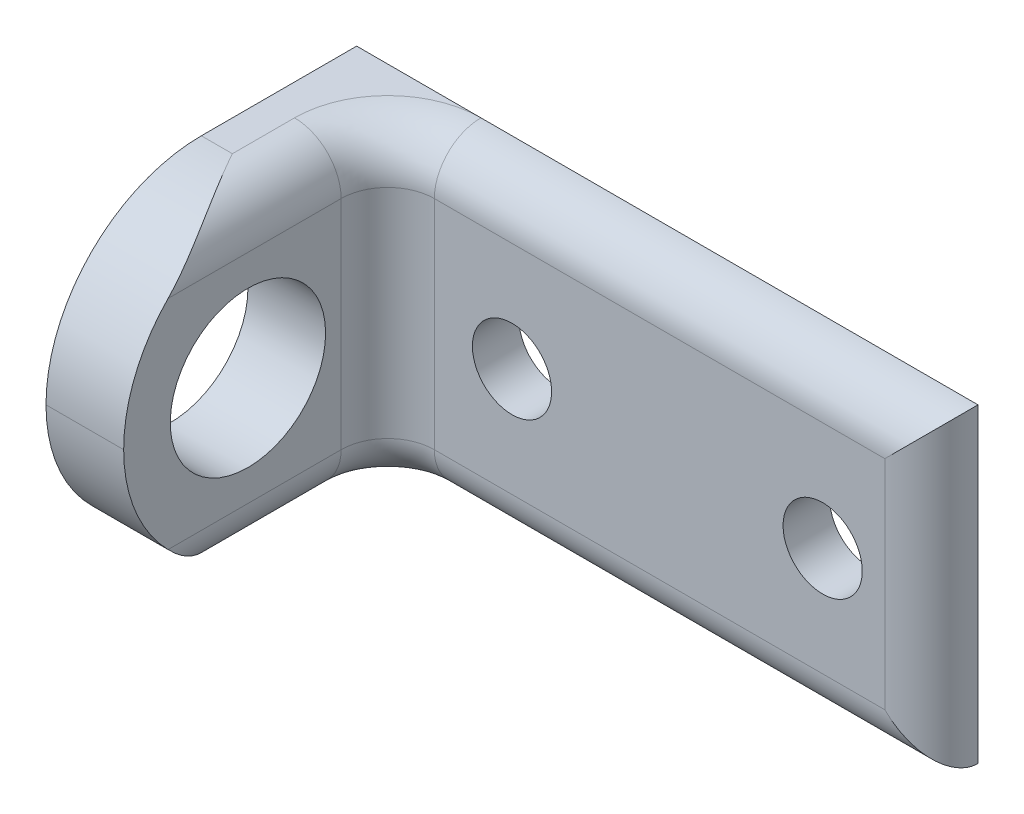
ISO-10303-21;
HEADER;
FILE_DESCRIPTION(('STEP AP214'),'2;1');
FILE_NAME('part.step','',(''),(''),'','','');
FILE_SCHEMA(('AUTOMOTIVE_DESIGN { 1 0 10303 214 1 1 1 1 }'));
ENDSEC;
DATA;
#1=APPLICATION_CONTEXT('core data for automotive mechanical design processes');
#2=APPLICATION_PROTOCOL_DEFINITION('international standard','automotive_design',2000,#1);
#3=PRODUCT_CONTEXT('',#1,'mechanical');
#4=PRODUCT('Part','Part','',(#3));
#5=PRODUCT_RELATED_PRODUCT_CATEGORY('part','',(#4));
#6=PRODUCT_DEFINITION_FORMATION('','',#4);
#7=PRODUCT_DEFINITION_CONTEXT('part definition',#1,'design');
#8=PRODUCT_DEFINITION('design','',#6,#7);
#9=PRODUCT_DEFINITION_SHAPE('','',#8);
#10=(LENGTH_UNIT() NAMED_UNIT(*) SI_UNIT(.MILLI.,.METRE.));
#11=(NAMED_UNIT(*) PLANE_ANGLE_UNIT() SI_UNIT($,.RADIAN.));
#12=(NAMED_UNIT(*) SI_UNIT($,.STERADIAN.) SOLID_ANGLE_UNIT());
#13=UNCERTAINTY_MEASURE_WITH_UNIT(LENGTH_MEASURE(1.E-05),#10,'distance_accuracy_value','');
#14=(GEOMETRIC_REPRESENTATION_CONTEXT(3) GLOBAL_UNCERTAINTY_ASSIGNED_CONTEXT((#13)) GLOBAL_UNIT_ASSIGNED_CONTEXT((#10,
#11,#12)) REPRESENTATION_CONTEXT('',''));
#15=CARTESIAN_POINT('',(0.,0.,0.));
#16=DIRECTION('',(0.,0.,1.));
#17=DIRECTION('',(1.,0.,0.));
#18=AXIS2_PLACEMENT_3D('',#15,#16,#17);
#19=CARTESIAN_POINT('',(-20.,-10.,3.));
#20=DIRECTION('',(0.,1.,0.));
#21=DIRECTION('',(0.,0.,1.));
#22=AXIS2_PLACEMENT_3D('',#19,#20,#21);
#23=PLANE('',#22);
#24=CARTESIAN_POINT('',(-12.,-10.,6.));
#25=DIRECTION('',(0.,1.,0.));
#26=DIRECTION('',(0.,0.,1.));
#27=AXIS2_PLACEMENT_3D('',#24,#25,#26);
#28=CIRCLE('',#27,6.);
#29=CARTESIAN_POINT('',(-18.,-10.,6.));
#30=VERTEX_POINT('',#29);
#31=CARTESIAN_POINT('',(-12.,-10.,0.));
#32=VERTEX_POINT('',#31);
#33=EDGE_CURVE('E242',#30,#32,#28,.F.);
#34=ORIENTED_EDGE('',*,*,#33,.F.);
#35=DIRECTION('',(0.,0.,-1.));
#36=VECTOR('',#35,1.);
#37=CARTESIAN_POINT('',(-18.,-10.,3.));
#38=LINE('',#37,#36);
#39=CARTESIAN_POINT('',(-18.,-10.,10.));
#40=VERTEX_POINT('',#39);
#41=EDGE_CURVE('E240',#30,#40,#38,.F.);
#42=ORIENTED_EDGE('',*,*,#41,.T.);
#43=DIRECTION('',(1.,0.,0.));
#44=VECTOR('',#43,1.);
#45=CARTESIAN_POINT('',(-20.,-10.,10.));
#46=LINE('',#45,#44);
#47=CARTESIAN_POINT('',(-20.,-10.,10.));
#48=VERTEX_POINT('',#47);
#49=EDGE_CURVE('E238',#40,#48,#46,.F.);
#50=ORIENTED_EDGE('',*,*,#49,.T.);
#51=DIRECTION('',(0.,0.,-1.));
#52=VECTOR('',#51,1.);
#53=CARTESIAN_POINT('',(-20.,-10.,3.));
#54=LINE('',#53,#52);
#55=CARTESIAN_POINT('',(-20.,-10.,0.));
#56=VERTEX_POINT('',#55);
#57=EDGE_CURVE('E257',#48,#56,#54,.T.);
#58=ORIENTED_EDGE('',*,*,#57,.T.);
#59=DIRECTION('',(1.,0.,0.));
#60=VECTOR('',#59,1.);
#61=CARTESIAN_POINT('',(-20.,-10.,0.));
#62=LINE('',#61,#60);
#63=EDGE_CURVE('E285',#56,#32,#62,.T.);
#64=ORIENTED_EDGE('',*,*,#63,.T.);
#65=EDGE_LOOP('',(#34,#42,#50,#58,#64));
#66=FACE_BOUND('',#65,.T.);
#67=ADVANCED_FACE('F34',(#66),#23,.F.);
#68=CARTESIAN_POINT('',(-20.,10.,3.));
#69=DIRECTION('',(0.,-1.,0.));
#70=DIRECTION('',(0.,0.,-1.));
#71=AXIS2_PLACEMENT_3D('',#68,#69,#70);
#72=PLANE('',#71);
#73=CARTESIAN_POINT('',(-12.,10.,6.));
#74=DIRECTION('',(0.,-1.,0.));
#75=DIRECTION('',(0.,0.,-1.));
#76=AXIS2_PLACEMENT_3D('',#73,#74,#75);
#77=CIRCLE('',#76,6.);
#78=CARTESIAN_POINT('',(-12.,10.,0.));
#79=VERTEX_POINT('',#78);
#80=CARTESIAN_POINT('',(-18.,10.,6.));
#81=VERTEX_POINT('',#80);
#82=EDGE_CURVE('E231',#79,#81,#77,.F.);
#83=ORIENTED_EDGE('',*,*,#82,.F.);
#84=DIRECTION('',(-1.,0.,0.));
#85=VECTOR('',#84,1.);
#86=CARTESIAN_POINT('',(-20.,10.,0.));
#87=LINE('',#86,#85);
#88=CARTESIAN_POINT('',(-20.,10.,0.));
#89=VERTEX_POINT('',#88);
#90=EDGE_CURVE('E125',#79,#89,#87,.T.);
#91=ORIENTED_EDGE('',*,*,#90,.T.);
#92=DIRECTION('',(0.,0.,-1.));
#93=VECTOR('',#92,1.);
#94=CARTESIAN_POINT('',(-20.,10.,3.));
#95=LINE('',#94,#93);
#96=CARTESIAN_POINT('',(-20.,10.,10.));
#97=VERTEX_POINT('',#96);
#98=EDGE_CURVE('E254',#97,#89,#95,.T.);
#99=ORIENTED_EDGE('',*,*,#98,.F.);
#100=DIRECTION('',(-1.,0.,0.));
#101=VECTOR('',#100,1.);
#102=CARTESIAN_POINT('',(-15.,10.,10.));
#103=LINE('',#102,#101);
#104=CARTESIAN_POINT('',(-18.,10.,10.));
#105=VERTEX_POINT('',#104);
#106=EDGE_CURVE('E256',#97,#105,#103,.F.);
#107=ORIENTED_EDGE('',*,*,#106,.T.);
#108=DIRECTION('',(0.,0.,-1.));
#109=VECTOR('',#108,1.);
#110=CARTESIAN_POINT('',(-18.,10.,3.));
#111=LINE('',#110,#109);
#112=EDGE_CURVE('E260',#105,#81,#111,.T.);
#113=ORIENTED_EDGE('',*,*,#112,.T.);
#114=EDGE_LOOP('',(#83,#91,#99,#107,#113));
#115=FACE_BOUND('',#114,.T.);
#116=ADVANCED_FACE('F176',(#115),#72,.F.);
#117=CARTESIAN_POINT('',(0.,0.,3.));
#118=DIRECTION('',(0.,0.,-1.));
#119=DIRECTION('',(-1.,0.,0.));
#120=AXIS2_PLACEMENT_3D('',#117,#118,#119);
#121=PLANE('',#120);
#122=CARTESIAN_POINT('',(13.,0.,3.));
#123=DIRECTION('',(0.,0.,-1.));
#124=DIRECTION('',(-1.,0.,0.));
#125=AXIS2_PLACEMENT_3D('',#122,#123,#124);
#126=CIRCLE('',#125,2.55);
#127=CARTESIAN_POINT('',(10.45,0.,3.));
#128=VERTEX_POINT('',#127);
#129=EDGE_CURVE('E269',#128,#128,#126,.F.);
#130=ORIENTED_EDGE('',*,*,#129,.F.);
#131=EDGE_LOOP('',(#130));
#132=FACE_BOUND('',#131,.T.);
#133=CARTESIAN_POINT('',(-6.99999999999999,0.,3.));
#134=DIRECTION('',(0.,0.,-1.));
#135=DIRECTION('',(-1.,0.,0.));
#136=AXIS2_PLACEMENT_3D('',#133,#134,#135);
#137=CIRCLE('',#136,2.55);
#138=CARTESIAN_POINT('',(-9.54999999999999,0.,3.));
#139=VERTEX_POINT('',#138);
#140=EDGE_CURVE('E271',#139,#139,#137,.F.);
#141=ORIENTED_EDGE('',*,*,#140,.F.);
#142=EDGE_LOOP('',(#141));
#143=FACE_BOUND('',#142,.T.);
#144=DIRECTION('',(0.,1.,0.));
#145=VECTOR('',#144,1.);
#146=CARTESIAN_POINT('',(17.,0.,3.));
#147=LINE('',#146,#145);
#148=CARTESIAN_POINT('',(17.,-7.,3.));
#149=VERTEX_POINT('',#148);
#150=CARTESIAN_POINT('',(17.,7.,3.));
#151=VERTEX_POINT('',#150);
#152=EDGE_CURVE('E57',#149,#151,#147,.T.);
#153=ORIENTED_EDGE('',*,*,#152,.T.);
#154=DIRECTION('',(-1.,0.,0.));
#155=VECTOR('',#154,1.);
#156=CARTESIAN_POINT('',(0.,7.,3.));
#157=LINE('',#156,#155);
#158=CARTESIAN_POINT('',(-12.,7.,3.));
#159=VERTEX_POINT('',#158);
#160=EDGE_CURVE('E141',#151,#159,#157,.T.);
#161=ORIENTED_EDGE('',*,*,#160,.T.);
#162=DIRECTION('',(0.,1.,0.));
#163=VECTOR('',#162,1.);
#164=CARTESIAN_POINT('',(-12.,-10.,3.));
#165=LINE('',#164,#163);
#166=CARTESIAN_POINT('',(-12.,-7.,3.));
#167=VERTEX_POINT('',#166);
#168=EDGE_CURVE('E245',#159,#167,#165,.F.);
#169=ORIENTED_EDGE('',*,*,#168,.T.);
#170=DIRECTION('',(1.,0.,0.));
#171=VECTOR('',#170,1.);
#172=CARTESIAN_POINT('',(0.,-7.,3.));
#173=LINE('',#172,#171);
#174=EDGE_CURVE('E247',#167,#149,#173,.T.);
#175=ORIENTED_EDGE('',*,*,#174,.T.);
#176=EDGE_LOOP('',(#153,#161,#169,#175));
#177=FACE_BOUND('',#176,.T.);
#178=ADVANCED_FACE('F182',(#132,#143,#177),#121,.F.);
#179=CARTESIAN_POINT('',(-20.,-10.,3.));
#180=DIRECTION('',(1.,0.,0.));
#181=DIRECTION('',(0.,0.,-1.));
#182=AXIS2_PLACEMENT_3D('',#179,#180,#181);
#183=PLANE('',#182);
#184=CARTESIAN_POINT('',(-20.,0.,12.));
#185=DIRECTION('',(1.,0.,0.));
#186=DIRECTION('',(0.,0.,-1.));
#187=AXIS2_PLACEMENT_3D('',#184,#185,#186);
#188=CIRCLE('',#187,5.);
#189=CARTESIAN_POINT('',(-20.,0.,7.));
#190=VERTEX_POINT('',#189);
#191=EDGE_CURVE('E280',#190,#190,#188,.T.);
#192=ORIENTED_EDGE('',*,*,#191,.T.);
#193=EDGE_LOOP('',(#192));
#194=FACE_BOUND('',#193,.T.);
#195=ORIENTED_EDGE('',*,*,#57,.F.);
#196=CARTESIAN_POINT('',(-20.,0.,10.));
#197=DIRECTION('',(1.,0.,0.));
#198=DIRECTION('',(0.,0.,-1.));
#199=AXIS2_PLACEMENT_3D('',#196,#197,#198);
#200=CIRCLE('',#199,10.);
#201=CARTESIAN_POINT('',(-20.,0.,20.));
#202=VERTEX_POINT('',#201);
#203=EDGE_CURVE('E12',#48,#202,#200,.F.);
#204=ORIENTED_EDGE('',*,*,#203,.T.);
#205=CARTESIAN_POINT('',(-20.,0.,10.));
#206=DIRECTION('',(1.,0.,0.));
#207=DIRECTION('',(0.,0.,-1.));
#208=AXIS2_PLACEMENT_3D('',#205,#206,#207);
#209=CIRCLE('',#208,10.);
#210=EDGE_CURVE('E43',#202,#97,#209,.F.);
#211=ORIENTED_EDGE('',*,*,#210,.T.);
#212=ORIENTED_EDGE('',*,*,#98,.T.);
#213=DIRECTION('',(0.,-1.,0.));
#214=VECTOR('',#213,1.);
#215=CARTESIAN_POINT('',(-20.,-10.,0.));
#216=LINE('',#215,#214);
#217=EDGE_CURVE('E130',#89,#56,#216,.T.);
#218=ORIENTED_EDGE('',*,*,#217,.T.);
#219=EDGE_LOOP('',(#195,#204,#211,#212,#218));
#220=FACE_BOUND('',#219,.T.);
#221=ADVANCED_FACE('F188',(#194,#220),#183,.F.);
#222=CARTESIAN_POINT('',(0.,0.,0.));
#223=DIRECTION('',(0.,0.,-1.));
#224=DIRECTION('',(-1.,0.,0.));
#225=AXIS2_PLACEMENT_3D('',#222,#223,#224);
#226=PLANE('',#225);
#227=CARTESIAN_POINT('',(13.,0.,0.));
#228=DIRECTION('',(0.,0.,1.));
#229=DIRECTION('',(1.,0.,0.));
#230=AXIS2_PLACEMENT_3D('',#227,#228,#229);
#231=CIRCLE('',#230,2.55);
#232=CARTESIAN_POINT('',(15.55,0.,0.));
#233=VERTEX_POINT('',#232);
#234=EDGE_CURVE('E276',#233,#233,#231,.T.);
#235=ORIENTED_EDGE('',*,*,#234,.T.);
#236=EDGE_LOOP('',(#235));
#237=FACE_BOUND('',#236,.T.);
#238=CARTESIAN_POINT('',(-6.99999999999999,0.,0.));
#239=DIRECTION('',(0.,0.,1.));
#240=DIRECTION('',(1.,0.,0.));
#241=AXIS2_PLACEMENT_3D('',#238,#239,#240);
#242=CIRCLE('',#241,2.55);
#243=CARTESIAN_POINT('',(-4.44999999999999,0.,0.));
#244=VERTEX_POINT('',#243);
#245=EDGE_CURVE('E328',#244,#244,#242,.T.);
#246=ORIENTED_EDGE('',*,*,#245,.T.);
#247=EDGE_LOOP('',(#246));
#248=FACE_BOUND('',#247,.T.);
#249=ORIENTED_EDGE('',*,*,#217,.F.);
#250=ORIENTED_EDGE('',*,*,#90,.F.);
#251=CARTESIAN_POINT('',(20.,10.,0.));
#252=VERTEX_POINT('',#251);
#253=EDGE_CURVE('E119',#252,#79,#87,.T.);
#254=ORIENTED_EDGE('',*,*,#253,.F.);
#255=DIRECTION('',(0.,1.,0.));
#256=VECTOR('',#255,1.);
#257=CARTESIAN_POINT('',(20.,-10.,0.));
#258=LINE('',#257,#256);
#259=CARTESIAN_POINT('',(20.,-10.,0.));
#260=VERTEX_POINT('',#259);
#261=EDGE_CURVE('E123',#260,#252,#258,.T.);
#262=ORIENTED_EDGE('',*,*,#261,.F.);
#263=EDGE_CURVE('E284',#32,#260,#62,.T.);
#264=ORIENTED_EDGE('',*,*,#263,.F.);
#265=ORIENTED_EDGE('',*,*,#63,.F.);
#266=EDGE_LOOP('',(#249,#250,#254,#262,#264,#265));
#267=FACE_BOUND('',#266,.T.);
#268=ADVANCED_FACE('F122',(#237,#248,#267),#226,.T.);
#269=CARTESIAN_POINT('',(-15.,10.,20.));
#270=DIRECTION('',(-1.,0.,0.));
#271=DIRECTION('',(0.,-1.,0.));
#272=AXIS2_PLACEMENT_3D('',#269,#270,#271);
#273=PLANE('',#272);
#274=CARTESIAN_POINT('',(-15.,0.,12.));
#275=DIRECTION('',(-1.,0.,0.));
#276=DIRECTION('',(0.,-1.,0.));
#277=AXIS2_PLACEMENT_3D('',#274,#275,#276);
#278=CIRCLE('',#277,5.);
#279=CARTESIAN_POINT('',(-15.,-5.,12.));
#280=VERTEX_POINT('',#279);
#281=EDGE_CURVE('E138',#280,#280,#278,.T.);
#282=ORIENTED_EDGE('',*,*,#281,.T.);
#283=EDGE_LOOP('',(#282));
#284=FACE_BOUND('',#283,.T.);
#285=DIRECTION('',(0.,0.,-1.));
#286=VECTOR('',#285,1.);
#287=CARTESIAN_POINT('',(-15.,-7.,20.));
#288=LINE('',#287,#286);
#289=CARTESIAN_POINT('',(-15.,-7.,17.1414284285429));
#290=VERTEX_POINT('',#289);
#291=CARTESIAN_POINT('',(-15.,-7.,6.));
#292=VERTEX_POINT('',#291);
#293=EDGE_CURVE('E227',#290,#292,#288,.T.);
#294=ORIENTED_EDGE('',*,*,#293,.T.);
#295=DIRECTION('',(0.,1.,0.));
#296=VECTOR('',#295,1.);
#297=CARTESIAN_POINT('',(-15.,10.,6.));
#298=LINE('',#297,#296);
#299=CARTESIAN_POINT('',(-15.,7.,6.));
#300=VERTEX_POINT('',#299);
#301=EDGE_CURVE('E236',#292,#300,#298,.T.);
#302=ORIENTED_EDGE('',*,*,#301,.T.);
#303=DIRECTION('',(0.,0.,-1.));
#304=VECTOR('',#303,1.);
#305=CARTESIAN_POINT('',(-15.,7.,20.));
#306=LINE('',#305,#304);
#307=CARTESIAN_POINT('',(-15.,7.,17.1414284285428));
#308=VERTEX_POINT('',#307);
#309=EDGE_CURVE('E229',#300,#308,#306,.F.);
#310=ORIENTED_EDGE('',*,*,#309,.T.);
#311=CARTESIAN_POINT('',(-15.,0.,10.));
#312=DIRECTION('',(-1.,0.,0.));
#313=DIRECTION('',(0.,-1.,0.));
#314=AXIS2_PLACEMENT_3D('',#311,#312,#313);
#315=CIRCLE('',#314,10.);
#316=CARTESIAN_POINT('',(-15.,0.,20.));
#317=VERTEX_POINT('',#316);
#318=EDGE_CURVE('E218',#308,#317,#315,.F.);
#319=ORIENTED_EDGE('',*,*,#318,.T.);
#320=CARTESIAN_POINT('',(-15.,0.,10.));
#321=DIRECTION('',(-1.,0.,0.));
#322=DIRECTION('',(0.,-1.,0.));
#323=AXIS2_PLACEMENT_3D('',#320,#321,#322);
#324=CIRCLE('',#323,10.);
#325=EDGE_CURVE('E223',#317,#290,#324,.F.);
#326=ORIENTED_EDGE('',*,*,#325,.T.);
#327=EDGE_LOOP('',(#294,#302,#310,#319,#326));
#328=FACE_BOUND('',#327,.T.);
#329=ADVANCED_FACE('F298',(#284,#328),#273,.F.);
#330=CARTESIAN_POINT('',(-20.,0.,12.));
#331=DIRECTION('',(1.,0.,0.));
#332=DIRECTION('',(0.,0.,-1.));
#333=AXIS2_PLACEMENT_3D('',#330,#331,#332);
#334=CYLINDRICAL_SURFACE('',#333,5.);
#335=ORIENTED_EDGE('',*,*,#191,.F.);
#336=EDGE_LOOP('',(#335));
#337=FACE_BOUND('',#336,.T.);
#338=ORIENTED_EDGE('',*,*,#281,.F.);
#339=EDGE_LOOP('',(#338));
#340=FACE_BOUND('',#339,.T.);
#341=ADVANCED_FACE('F311',(#337,#340),#334,.F.);
#342=CARTESIAN_POINT('',(0.,-7.,0.));
#343=DIRECTION('',(1.,0.,0.));
#344=DIRECTION('',(0.,0.,-1.));
#345=AXIS2_PLACEMENT_3D('',#342,#343,#344);
#346=CYLINDRICAL_SURFACE('',#345,3.);
#347=CARTESIAN_POINT('',(-12.,-7.,0.));
#348=DIRECTION('',(-1.,0.,0.));
#349=DIRECTION('',(0.,0.,1.));
#350=AXIS2_PLACEMENT_3D('',#347,#348,#349);
#351=CIRCLE('',#350,3.);
#352=EDGE_CURVE('E293',#32,#167,#351,.T.);
#353=ORIENTED_EDGE('',*,*,#352,.F.);
#354=ORIENTED_EDGE('',*,*,#263,.T.);
#355=CARTESIAN_POINT('',(17.,-7.,0.));
#356=DIRECTION('',(0.707106781186547,0.707106781186547,0.));
#357=DIRECTION('',(0.707106781186547,-0.707106781186547,0.));
#358=AXIS2_PLACEMENT_3D('',#355,#356,#357);
#359=ELLIPSE('',#358,4.24264068711928,3.);
#360=EDGE_CURVE('E38',#149,#260,#359,.T.);
#361=ORIENTED_EDGE('',*,*,#360,.F.);
#362=ORIENTED_EDGE('',*,*,#174,.F.);
#363=EDGE_LOOP('',(#353,#354,#361,#362));
#364=FACE_BOUND('',#363,.T.);
#365=ADVANCED_FACE('F36',(#364),#346,.T.);
#366=CARTESIAN_POINT('',(-18.,-7.,20.));
#367=DIRECTION('',(0.,0.,-1.));
#368=DIRECTION('',(-1.,0.,0.));
#369=AXIS2_PLACEMENT_3D('',#366,#367,#368);
#370=CYLINDRICAL_SURFACE('',#369,3.);
#371=CARTESIAN_POINT('',(-15.,-7.,17.1414284285429));
#372=CARTESIAN_POINT('',(-15.0000404215242,-7.11978461899118,17.0240547312688));
#373=CARTESIAN_POINT('',(-15.0071684385575,-7.23646398815508,16.9037419237787));
#374=CARTESIAN_POINT('',(-15.0337197390789,-7.46281144496142,16.6583855799033));
#375=CARTESIAN_POINT('',(-15.0531194338389,-7.57249254045578,16.5333515513046));
#376=CARTESIAN_POINT('',(-15.102122663697,-7.78353335626953,16.2804094097201));
#377=CARTESIAN_POINT('',(-15.1316309205253,-7.88496020709181,16.1525382041165));
#378=CARTESIAN_POINT('',(-15.1994060622169,-8.08045535266249,15.8934364767731));
#379=CARTESIAN_POINT('',(-15.2376786484903,-8.17451880365583,15.7622038178991));
#380=CARTESIAN_POINT('',(-15.3423247877262,-8.39959186008119,15.4317711428192));
#381=CARTESIAN_POINT('',(-15.4132616560136,-8.52602155970913,15.2308847345808));
#382=CARTESIAN_POINT('',(-15.5681340696485,-8.76238400243691,14.8245134746684));
#383=CARTESIAN_POINT('',(-15.6520734074084,-8.87231191400441,14.6190272963927));
#384=CARTESIAN_POINT('',(-15.8306687231035,-9.07666034610453,14.2033531381744));
#385=CARTESIAN_POINT('',(-15.9253843465012,-9.17098668694942,13.9931447261343));
#386=CARTESIAN_POINT('',(-16.1228289933826,-9.34380923240271,13.5700776072328));
#387=CARTESIAN_POINT('',(-16.2255575452125,-9.42230636777019,13.3572190569816));
#388=CARTESIAN_POINT('',(-16.4586379441501,-9.57830419020177,12.8860876609365));
#389=CARTESIAN_POINT('',(-16.5903680309685,-9.65237727779146,12.6273555977777));
#390=CARTESIAN_POINT('',(-16.8600243835059,-9.7789670466287,12.1079224072917));
#391=CARTESIAN_POINT('',(-16.997952450183,-9.83147741683283,11.8472207261952));
#392=CARTESIAN_POINT('',(-17.4168171176717,-9.9571376274228,11.0647735604219));
#393=CARTESIAN_POINT('',(-17.7038555651728,-9.99906742923478,10.5406836394851));
#394=CARTESIAN_POINT('',(-17.993594944974,-9.99999486677594,10.0116939890858));
#395=CARTESIAN_POINT('',(-17.9967975098694,-9.99999999465083,10.0058469325132));
#396=CARTESIAN_POINT('',(-18.,-10.,10.));
#397=B_SPLINE_CURVE_WITH_KNOTS('',3,(#371,#372,#373,#374,#375,#376,#377,#378,#379,#380,#381,
#382,#383,#384,#385,#386,#387,#388,#389,#390,#391,#392,#393,#394,#395,#396),.UNSPECIFIED.,.F.,
.F.,(4,2,2,2,2,2,2,2,2,2,2,2,4),(0.,0.502681257877663,1.00439918142352,1.50151265730891,
1.99895044094774,2.74102058336977,3.48330757333005,4.22992365575303,4.97649582425589,
5.87440692538573,6.77258064294605,8.56196658141676,8.58196658733393),.UNSPECIFIED.);
#398=EDGE_CURVE('E142',#40,#290,#397,.F.);
#399=ORIENTED_EDGE('',*,*,#398,.F.);
#400=ORIENTED_EDGE('',*,*,#41,.F.);
#401=CARTESIAN_POINT('',(-18.,-7.,6.));
#402=DIRECTION('',(0.,0.,-1.));
#403=DIRECTION('',(-1.,0.,0.));
#404=AXIS2_PLACEMENT_3D('',#401,#402,#403);
#405=CIRCLE('',#404,3.);
#406=EDGE_CURVE('E146',#292,#30,#405,.T.);
#407=ORIENTED_EDGE('',*,*,#406,.F.);
#408=ORIENTED_EDGE('',*,*,#293,.F.);
#409=EDGE_LOOP('',(#399,#400,#407,#408));
#410=FACE_BOUND('',#409,.T.);
#411=ADVANCED_FACE('F159',(#410),#370,.T.);
#412=CARTESIAN_POINT('',(17.,0.,0.));
#413=DIRECTION('',(0.,1.,0.));
#414=DIRECTION('',(0.,0.,1.));
#415=AXIS2_PLACEMENT_3D('',#412,#413,#414);
#416=CYLINDRICAL_SURFACE('',#415,3.);
#417=ORIENTED_EDGE('',*,*,#360,.T.);
#418=ORIENTED_EDGE('',*,*,#261,.T.);
#419=CARTESIAN_POINT('',(17.,7.,0.));
#420=DIRECTION('',(-0.707106781186547,0.707106781186547,0.));
#421=DIRECTION('',(0.707106781186547,0.707106781186547,0.));
#422=AXIS2_PLACEMENT_3D('',#419,#420,#421);
#423=ELLIPSE('',#422,4.24264068711928,3.);
#424=EDGE_CURVE('E135',#151,#252,#423,.T.);
#425=ORIENTED_EDGE('',*,*,#424,.F.);
#426=ORIENTED_EDGE('',*,*,#152,.F.);
#427=EDGE_LOOP('',(#417,#418,#425,#426));
#428=FACE_BOUND('',#427,.T.);
#429=ADVANCED_FACE('F134',(#428),#416,.T.);
#430=CARTESIAN_POINT('',(-12.,-7.,6.));
#431=DIRECTION('',(0.,1.,0.));
#432=DIRECTION('',(0.,0.,1.));
#433=AXIS2_PLACEMENT_3D('',#430,#431,#432);
#434=TOROIDAL_SURFACE('',#433,6.,3.);
#435=ORIENTED_EDGE('',*,*,#33,.T.);
#436=ORIENTED_EDGE('',*,*,#352,.T.);
#437=CARTESIAN_POINT('',(-12.,-7.,6.));
#438=DIRECTION('',(0.,1.,0.));
#439=DIRECTION('',(0.,0.,1.));
#440=AXIS2_PLACEMENT_3D('',#437,#438,#439);
#441=CIRCLE('',#440,3.);
#442=EDGE_CURVE('E143',#292,#167,#441,.F.);
#443=ORIENTED_EDGE('',*,*,#442,.F.);
#444=ORIENTED_EDGE('',*,*,#406,.T.);
#445=EDGE_LOOP('',(#435,#436,#443,#444));
#446=FACE_BOUND('',#445,.T.);
#447=ADVANCED_FACE('F166',(#446),#434,.T.);
#448=CARTESIAN_POINT('',(0.,0.,10.));
#449=DIRECTION('',(-1.,0.,0.));
#450=DIRECTION('',(0.,0.,1.));
#451=AXIS2_PLACEMENT_3D('',#448,#449,#450);
#452=CYLINDRICAL_SURFACE('',#451,10.);
#453=ORIENTED_EDGE('',*,*,#398,.T.);
#454=ORIENTED_EDGE('',*,*,#325,.F.);
#455=DIRECTION('',(1.,0.,0.));
#456=VECTOR('',#455,1.);
#457=CARTESIAN_POINT('',(-15.,0.,20.));
#458=LINE('',#457,#456);
#459=EDGE_CURVE('E149',#202,#317,#458,.T.);
#460=ORIENTED_EDGE('',*,*,#459,.F.);
#461=ORIENTED_EDGE('',*,*,#203,.F.);
#462=ORIENTED_EDGE('',*,*,#49,.F.);
#463=EDGE_LOOP('',(#453,#454,#460,#461,#462));
#464=FACE_BOUND('',#463,.T.);
#465=ADVANCED_FACE('F162',(#464),#452,.T.);
#466=CARTESIAN_POINT('',(0.,7.,0.));
#467=DIRECTION('',(-1.,0.,0.));
#468=DIRECTION('',(0.,0.,1.));
#469=AXIS2_PLACEMENT_3D('',#466,#467,#468);
#470=CYLINDRICAL_SURFACE('',#469,3.);
#471=ORIENTED_EDGE('',*,*,#424,.T.);
#472=ORIENTED_EDGE('',*,*,#253,.T.);
#473=CARTESIAN_POINT('',(-12.,7.,0.));
#474=DIRECTION('',(-1.,0.,0.));
#475=DIRECTION('',(0.,0.,1.));
#476=AXIS2_PLACEMENT_3D('',#473,#474,#475);
#477=CIRCLE('',#476,3.);
#478=EDGE_CURVE('E213',#159,#79,#477,.T.);
#479=ORIENTED_EDGE('',*,*,#478,.F.);
#480=ORIENTED_EDGE('',*,*,#160,.F.);
#481=EDGE_LOOP('',(#471,#472,#479,#480));
#482=FACE_BOUND('',#481,.T.);
#483=ADVANCED_FACE('F140',(#482),#470,.T.);
#484=CARTESIAN_POINT('',(-12.,10.,6.));
#485=DIRECTION('',(0.,-1.,0.));
#486=DIRECTION('',(1.,0.,0.));
#487=AXIS2_PLACEMENT_3D('',#484,#485,#486);
#488=CYLINDRICAL_SURFACE('',#487,3.);
#489=ORIENTED_EDGE('',*,*,#442,.T.);
#490=ORIENTED_EDGE('',*,*,#168,.F.);
#491=CARTESIAN_POINT('',(-12.,7.,6.));
#492=DIRECTION('',(0.,-1.,0.));
#493=DIRECTION('',(0.,0.,-1.));
#494=AXIS2_PLACEMENT_3D('',#491,#492,#493);
#495=CIRCLE('',#494,3.);
#496=EDGE_CURVE('E210',#300,#159,#495,.T.);
#497=ORIENTED_EDGE('',*,*,#496,.F.);
#498=ORIENTED_EDGE('',*,*,#301,.F.);
#499=EDGE_LOOP('',(#489,#490,#497,#498));
#500=FACE_BOUND('',#499,.T.);
#501=ADVANCED_FACE('F197',(#500),#488,.F.);
#502=CARTESIAN_POINT('',(0.,0.,10.));
#503=DIRECTION('',(1.,0.,0.));
#504=DIRECTION('',(0.,0.,-1.));
#505=AXIS2_PLACEMENT_3D('',#502,#503,#504);
#506=CYLINDRICAL_SURFACE('',#505,10.);
#507=ORIENTED_EDGE('',*,*,#459,.T.);
#508=ORIENTED_EDGE('',*,*,#318,.F.);
#509=CARTESIAN_POINT('',(-15.,7.,17.1414284285428));
#510=CARTESIAN_POINT('',(-15.0000404215242,7.11978461899115,17.0240547312688));
#511=CARTESIAN_POINT('',(-15.0071684385575,7.23646398815502,16.9037419237788));
#512=CARTESIAN_POINT('',(-15.0337197390789,7.4628114449613,16.6583855799034));
#513=CARTESIAN_POINT('',(-15.0531194338389,7.57249254045563,16.5333515513048));
#514=CARTESIAN_POINT('',(-15.102122663697,7.78353335626938,16.2804094097202));
#515=CARTESIAN_POINT('',(-15.1316309205253,7.8849602070917,16.1525382041166));
#516=CARTESIAN_POINT('',(-15.1994060622169,8.08045535266244,15.8934364767732));
#517=CARTESIAN_POINT('',(-15.2376786484903,8.1745188036558,15.7622038178991));
#518=CARTESIAN_POINT('',(-15.3423247877263,8.39959186008122,15.4317711428192));
#519=CARTESIAN_POINT('',(-15.4132616560137,8.52602155970917,15.2308847345807));
#520=CARTESIAN_POINT('',(-15.5681340696485,8.76238400243698,14.8245134746683));
#521=CARTESIAN_POINT('',(-15.6520734074084,8.87231191400449,14.6190272963925));
#522=CARTESIAN_POINT('',(-15.8306687231036,9.0766603461046,14.2033531381742));
#523=CARTESIAN_POINT('',(-15.9253843465012,9.17098668694947,13.9931447261342));
#524=CARTESIAN_POINT('',(-16.1228289933827,9.34380923240273,13.5700776072328));
#525=CARTESIAN_POINT('',(-16.2255575452125,9.4223063677702,13.3572190569816));
#526=CARTESIAN_POINT('',(-16.4586379441501,9.57830419020177,12.8860876609366));
#527=CARTESIAN_POINT('',(-16.5903680309688,9.65237727779146,12.6273555977778));
#528=CARTESIAN_POINT('',(-16.8600243835056,9.7789670466287,12.1079224072916));
#529=CARTESIAN_POINT('',(-16.9979524501821,9.83147741683282,11.8472207261947));
#530=CARTESIAN_POINT('',(-17.4168171176734,9.95713762742279,11.0647735604229));
#531=CARTESIAN_POINT('',(-17.7038555651822,9.99906742923479,10.5406836394903));
#532=CARTESIAN_POINT('',(-17.9935949449742,9.99999486677594,10.0116939890859));
#533=CARTESIAN_POINT('',(-17.9967975098695,9.99999999465083,10.0058469325132));
#534=CARTESIAN_POINT('',(-18.,10.,10.));
#535=B_SPLINE_CURVE_WITH_KNOTS('',3,(#509,#510,#511,#512,#513,#514,#515,#516,#517,#518,#519,
#520,#521,#522,#523,#524,#525,#526,#527,#528,#529,#530,#531,#532,#533,#534),.UNSPECIFIED.,.F.,
.F.,(4,2,2,2,2,2,2,2,2,2,2,2,4),(0.,0.502681257877519,1.00439918142323,1.50151265730876,
1.99895044094774,2.74102058336988,3.48330757333026,4.22992365575312,4.97649582425589,
5.87440692538571,6.77258064294596,8.56196658141675,8.58196658733393),.UNSPECIFIED.);
#536=EDGE_CURVE('E203',#105,#308,#535,.F.);
#537=ORIENTED_EDGE('',*,*,#536,.F.);
#538=ORIENTED_EDGE('',*,*,#106,.F.);
#539=ORIENTED_EDGE('',*,*,#210,.F.);
#540=EDGE_LOOP('',(#507,#508,#537,#538,#539));
#541=FACE_BOUND('',#540,.T.);
#542=ADVANCED_FACE('F192',(#541),#506,.T.);
#543=CARTESIAN_POINT('',(-12.,7.,6.));
#544=DIRECTION('',(0.,-1.,0.));
#545=DIRECTION('',(0.,0.,-1.));
#546=AXIS2_PLACEMENT_3D('',#543,#544,#545);
#547=TOROIDAL_SURFACE('',#546,6.,3.);
#548=ORIENTED_EDGE('',*,*,#478,.T.);
#549=ORIENTED_EDGE('',*,*,#82,.T.);
#550=CARTESIAN_POINT('',(-18.,7.,6.));
#551=DIRECTION('',(0.,0.,-1.));
#552=DIRECTION('',(-1.,0.,0.));
#553=AXIS2_PLACEMENT_3D('',#550,#551,#552);
#554=CIRCLE('',#553,3.);
#555=EDGE_CURVE('E211',#300,#81,#554,.F.);
#556=ORIENTED_EDGE('',*,*,#555,.F.);
#557=ORIENTED_EDGE('',*,*,#496,.T.);
#558=EDGE_LOOP('',(#548,#549,#556,#557));
#559=FACE_BOUND('',#558,.T.);
#560=ADVANCED_FACE('F196',(#559),#547,.T.);
#561=CARTESIAN_POINT('',(-18.,7.,3.));
#562=DIRECTION('',(0.,0.,-1.));
#563=DIRECTION('',(-1.,0.,0.));
#564=AXIS2_PLACEMENT_3D('',#561,#562,#563);
#565=CYLINDRICAL_SURFACE('',#564,3.);
#566=ORIENTED_EDGE('',*,*,#536,.T.);
#567=ORIENTED_EDGE('',*,*,#309,.F.);
#568=ORIENTED_EDGE('',*,*,#555,.T.);
#569=ORIENTED_EDGE('',*,*,#112,.F.);
#570=EDGE_LOOP('',(#566,#567,#568,#569));
#571=FACE_BOUND('',#570,.T.);
#572=ADVANCED_FACE('F199',(#571),#565,.T.);
#573=CARTESIAN_POINT('',(-6.99999999999999,0.,20.));
#574=DIRECTION('',(0.,0.,-1.));
#575=DIRECTION('',(-1.,0.,0.));
#576=AXIS2_PLACEMENT_3D('',#573,#574,#575);
#577=CYLINDRICAL_SURFACE('',#576,2.55);
#578=ORIENTED_EDGE('',*,*,#245,.F.);
#579=EDGE_LOOP('',(#578));
#580=FACE_BOUND('',#579,.T.);
#581=ORIENTED_EDGE('',*,*,#140,.T.);
#582=EDGE_LOOP('',(#581));
#583=FACE_BOUND('',#582,.T.);
#584=ADVANCED_FACE('F316',(#580,#583),#577,.F.);
#585=CARTESIAN_POINT('',(13.,0.,20.));
#586=DIRECTION('',(0.,0.,-1.));
#587=DIRECTION('',(-1.,0.,0.));
#588=AXIS2_PLACEMENT_3D('',#585,#586,#587);
#589=CYLINDRICAL_SURFACE('',#588,2.55);
#590=ORIENTED_EDGE('',*,*,#234,.F.);
#591=EDGE_LOOP('',(#590));
#592=FACE_BOUND('',#591,.T.);
#593=ORIENTED_EDGE('',*,*,#129,.T.);
#594=EDGE_LOOP('',(#593));
#595=FACE_BOUND('',#594,.T.);
#596=ADVANCED_FACE('F319',(#592,#595),#589,.F.);
#597=CLOSED_SHELL('',(#67,#116,#178,#221,#268,#329,#341,#365,#411,#429,#447,#465,#483,#501,#542,
#560,#572,#584,#596));
#598=MANIFOLD_SOLID_BREP('B2',#597);
#599=ADVANCED_BREP_SHAPE_REPRESENTATION('',(#18,#598),#14);
#600=SHAPE_DEFINITION_REPRESENTATION(#9,#599);
ENDSEC;
END-ISO-10303-21;
